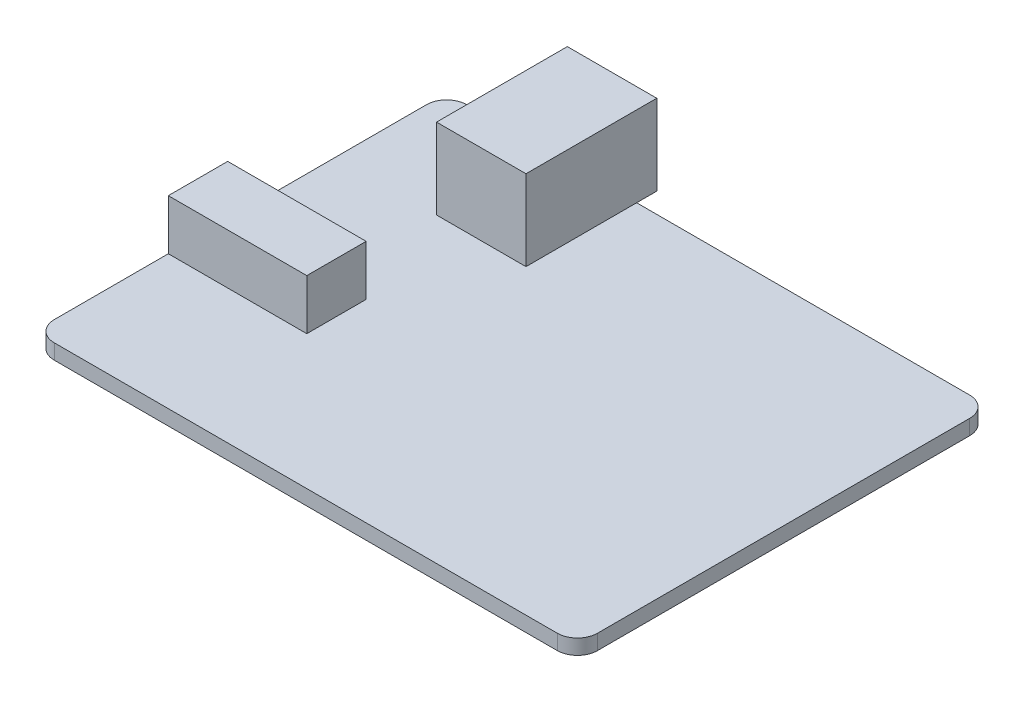
ISO-10303-21;
HEADER;
FILE_DESCRIPTION(('STEP AP214'),'2;1');
FILE_NAME('part.step','',(''),(''),'','','');
FILE_SCHEMA(('AUTOMOTIVE_DESIGN { 1 0 10303 214 1 1 1 1 }'));
ENDSEC;
DATA;
#1=APPLICATION_CONTEXT('core data for automotive mechanical design processes');
#2=APPLICATION_PROTOCOL_DEFINITION('international standard','automotive_design',2000,#1);
#3=PRODUCT_CONTEXT('',#1,'mechanical');
#4=PRODUCT('Part','Part','',(#3));
#5=PRODUCT_RELATED_PRODUCT_CATEGORY('part','',(#4));
#6=PRODUCT_DEFINITION_FORMATION('','',#4);
#7=PRODUCT_DEFINITION_CONTEXT('part definition',#1,'design');
#8=PRODUCT_DEFINITION('design','',#6,#7);
#9=PRODUCT_DEFINITION_SHAPE('','',#8);
#10=(LENGTH_UNIT() NAMED_UNIT(*) SI_UNIT(.MILLI.,.METRE.));
#11=(NAMED_UNIT(*) PLANE_ANGLE_UNIT() SI_UNIT($,.RADIAN.));
#12=(NAMED_UNIT(*) SI_UNIT($,.STERADIAN.) SOLID_ANGLE_UNIT());
#13=UNCERTAINTY_MEASURE_WITH_UNIT(LENGTH_MEASURE(1.E-05),#10,'distance_accuracy_value','');
#14=(GEOMETRIC_REPRESENTATION_CONTEXT(3) GLOBAL_UNCERTAINTY_ASSIGNED_CONTEXT((#13)) GLOBAL_UNIT_ASSIGNED_CONTEXT((#10,
#11,#12)) REPRESENTATION_CONTEXT('',''));
#15=CARTESIAN_POINT('',(0.,0.,0.));
#16=DIRECTION('',(0.,0.,1.));
#17=DIRECTION('',(1.,0.,0.));
#18=AXIS2_PLACEMENT_3D('',#15,#16,#17);
#19=CARTESIAN_POINT('',(0.,1.5,0.));
#20=DIRECTION('',(0.,-1.,0.));
#21=DIRECTION('',(0.,0.,-1.));
#22=AXIS2_PLACEMENT_3D('',#19,#20,#21);
#23=PLANE('',#22);
#24=DIRECTION('',(-1.,0.,0.));
#25=VECTOR('',#24,1.);
#26=CARTESIAN_POINT('',(13.7650080663848,1.5,-19.2368736736892));
#27=LINE('',#26,#25);
#28=CARTESIAN_POINT('',(13.7650080663848,1.5,-19.2368736736892));
#29=VERTEX_POINT('',#28);
#30=CARTESIAN_POINT('',(0.,1.5,-19.2368736736892));
#31=VERTEX_POINT('',#30);
#32=EDGE_CURVE('E50',#29,#31,#27,.T.);
#33=ORIENTED_EDGE('',*,*,#32,.F.);
#34=DIRECTION('',(0.,0.,-1.));
#35=VECTOR('',#34,1.);
#36=CARTESIAN_POINT('',(13.7650080663848,1.5,-19.2368736736892));
#37=LINE('',#36,#35);
#38=CARTESIAN_POINT('',(13.7650080663848,1.5,-13.3355569240685));
#39=VERTEX_POINT('',#38);
#40=EDGE_CURVE('E55',#39,#29,#37,.T.);
#41=ORIENTED_EDGE('',*,*,#40,.F.);
#42=DIRECTION('',(1.,0.,0.));
#43=VECTOR('',#42,1.);
#44=CARTESIAN_POINT('',(13.7650080663848,1.5,-13.3355569240685));
#45=LINE('',#44,#43);
#46=CARTESIAN_POINT('',(0.,1.5,-13.3355569240685));
#47=VERTEX_POINT('',#46);
#48=EDGE_CURVE('E172',#47,#39,#45,.T.);
#49=ORIENTED_EDGE('',*,*,#48,.F.);
#50=DIRECTION('',(0.,0.,1.));
#51=VECTOR('',#50,1.);
#52=CARTESIAN_POINT('',(0.,1.5,0.));
#53=LINE('',#52,#51);
#54=CARTESIAN_POINT('',(0.,1.5,-2.));
#55=VERTEX_POINT('',#54);
#56=EDGE_CURVE('E218',#47,#55,#53,.T.);
#57=ORIENTED_EDGE('',*,*,#56,.T.);
#58=CARTESIAN_POINT('',(2.,1.5,-2.));
#59=DIRECTION('',(0.,-1.,0.));
#60=DIRECTION('',(0.,0.,-1.));
#61=AXIS2_PLACEMENT_3D('',#58,#59,#60);
#62=CIRCLE('',#61,2.);
#63=CARTESIAN_POINT('',(2.,1.5,0.));
#64=VERTEX_POINT('',#63);
#65=EDGE_CURVE('E264',#55,#64,#62,.F.);
#66=ORIENTED_EDGE('',*,*,#65,.T.);
#67=DIRECTION('',(1.,0.,0.));
#68=VECTOR('',#67,1.);
#69=CARTESIAN_POINT('',(0.,1.5,0.));
#70=LINE('',#69,#68);
#71=CARTESIAN_POINT('',(52.,1.5,0.));
#72=VERTEX_POINT('',#71);
#73=EDGE_CURVE('E217',#64,#72,#70,.T.);
#74=ORIENTED_EDGE('',*,*,#73,.T.);
#75=CARTESIAN_POINT('',(52.,1.5,-2.));
#76=DIRECTION('',(0.,-1.,0.));
#77=DIRECTION('',(0.,0.,-1.));
#78=AXIS2_PLACEMENT_3D('',#75,#76,#77);
#79=CIRCLE('',#78,2.);
#80=CARTESIAN_POINT('',(54.,1.5,-2.));
#81=VERTEX_POINT('',#80);
#82=EDGE_CURVE('E262',#72,#81,#79,.F.);
#83=ORIENTED_EDGE('',*,*,#82,.T.);
#84=DIRECTION('',(0.,0.,-1.));
#85=VECTOR('',#84,1.);
#86=CARTESIAN_POINT('',(54.,1.5,0.));
#87=LINE('',#86,#85);
#88=CARTESIAN_POINT('',(54.,1.5,-39.));
#89=VERTEX_POINT('',#88);
#90=EDGE_CURVE('E221',#81,#89,#87,.T.);
#91=ORIENTED_EDGE('',*,*,#90,.T.);
#92=CARTESIAN_POINT('',(52.,1.5,-39.));
#93=DIRECTION('',(0.,-1.,0.));
#94=DIRECTION('',(0.,0.,-1.));
#95=AXIS2_PLACEMENT_3D('',#92,#93,#94);
#96=CIRCLE('',#95,2.);
#97=CARTESIAN_POINT('',(52.,1.5,-41.));
#98=VERTEX_POINT('',#97);
#99=EDGE_CURVE('E260',#89,#98,#96,.F.);
#100=ORIENTED_EDGE('',*,*,#99,.T.);
#101=DIRECTION('',(-1.,0.,0.));
#102=VECTOR('',#101,1.);
#103=CARTESIAN_POINT('',(0.,1.5,-41.));
#104=LINE('',#103,#102);
#105=CARTESIAN_POINT('',(18.89,1.5,-41.));
#106=VERTEX_POINT('',#105);
#107=EDGE_CURVE('E225',#98,#106,#104,.T.);
#108=ORIENTED_EDGE('',*,*,#107,.T.);
#109=DIRECTION('',(0.,0.,-1.));
#110=VECTOR('',#109,1.);
#111=CARTESIAN_POINT('',(18.89,1.5,-30.));
#112=LINE('',#111,#110);
#113=CARTESIAN_POINT('',(18.89,1.5,-30.));
#114=VERTEX_POINT('',#113);
#115=EDGE_CURVE('E199',#114,#106,#112,.T.);
#116=ORIENTED_EDGE('',*,*,#115,.F.);
#117=DIRECTION('',(1.,0.,0.));
#118=VECTOR('',#117,1.);
#119=CARTESIAN_POINT('',(9.99999999999999,1.5,-30.));
#120=LINE('',#119,#118);
#121=CARTESIAN_POINT('',(9.99999999999999,1.5,-30.));
#122=VERTEX_POINT('',#121);
#123=EDGE_CURVE('E178',#122,#114,#120,.T.);
#124=ORIENTED_EDGE('',*,*,#123,.F.);
#125=DIRECTION('',(0.,0.,1.));
#126=VECTOR('',#125,1.);
#127=CARTESIAN_POINT('',(9.99999999999999,1.5,-30.));
#128=LINE('',#127,#126);
#129=CARTESIAN_POINT('',(9.99999999999999,1.5,-41.));
#130=VERTEX_POINT('',#129);
#131=EDGE_CURVE('E180',#130,#122,#128,.T.);
#132=ORIENTED_EDGE('',*,*,#131,.F.);
#133=CARTESIAN_POINT('',(1.99999999999999,1.5,-41.));
#134=VERTEX_POINT('',#133);
#135=EDGE_CURVE('E224',#130,#134,#104,.T.);
#136=ORIENTED_EDGE('',*,*,#135,.T.);
#137=CARTESIAN_POINT('',(1.99999999999999,1.5,-39.));
#138=DIRECTION('',(0.,-1.,0.));
#139=DIRECTION('',(0.,0.,-1.));
#140=AXIS2_PLACEMENT_3D('',#137,#138,#139);
#141=CIRCLE('',#140,2.);
#142=CARTESIAN_POINT('',(0.,1.5,-39.));
#143=VERTEX_POINT('',#142);
#144=EDGE_CURVE('E258',#134,#143,#141,.F.);
#145=ORIENTED_EDGE('',*,*,#144,.T.);
#146=EDGE_CURVE('E215',#143,#31,#53,.T.);
#147=ORIENTED_EDGE('',*,*,#146,.T.);
#148=EDGE_LOOP('',(#33,#41,#49,#57,#66,#74,#83,#91,#100,#108,#116,#124,#132,#136,#145,#147));
#149=FACE_BOUND('',#148,.T.);
#150=ADVANCED_FACE('F35',(#149),#23,.F.);
#151=CARTESIAN_POINT('',(0.,1.5,0.));
#152=DIRECTION('',(1.,0.,0.));
#153=DIRECTION('',(0.,0.,-1.));
#154=AXIS2_PLACEMENT_3D('',#151,#152,#153);
#155=PLANE('',#154);
#156=CARTESIAN_POINT('',(0.,4.,-16.2862152988788));
#157=DIRECTION('',(-1.,0.,0.));
#158=DIRECTION('',(0.,0.,1.));
#159=AXIS2_PLACEMENT_3D('',#156,#157,#158);
#160=CIRCLE('',#159,1.5875);
#161=CARTESIAN_POINT('',(0.,4.,-14.6987152988788));
#162=VERTEX_POINT('',#161);
#163=EDGE_CURVE('E469',#162,#162,#160,.T.);
#164=ORIENTED_EDGE('',*,*,#163,.F.);
#165=EDGE_LOOP('',(#164));
#166=FACE_BOUND('',#165,.T.);
#167=DIRECTION('',(0.,0.,1.));
#168=VECTOR('',#167,1.);
#169=CARTESIAN_POINT('',(0.,0.,0.));
#170=LINE('',#169,#168);
#171=CARTESIAN_POINT('',(0.,0.,-39.));
#172=VERTEX_POINT('',#171);
#173=CARTESIAN_POINT('',(0.,0.,-2.));
#174=VERTEX_POINT('',#173);
#175=EDGE_CURVE('E214',#172,#174,#170,.T.);
#176=ORIENTED_EDGE('',*,*,#175,.T.);
#177=DIRECTION('',(0.,-1.,0.));
#178=VECTOR('',#177,1.);
#179=CARTESIAN_POINT('',(0.,1.5,-2.));
#180=LINE('',#179,#178);
#181=EDGE_CURVE('E255',#174,#55,#180,.F.);
#182=ORIENTED_EDGE('',*,*,#181,.T.);
#183=ORIENTED_EDGE('',*,*,#56,.F.);
#184=DIRECTION('',(0.,-1.,0.));
#185=VECTOR('',#184,1.);
#186=CARTESIAN_POINT('',(0.,6.5,-13.3355569240685));
#187=LINE('',#186,#185);
#188=CARTESIAN_POINT('',(0.,6.5,-13.3355569240685));
#189=VERTEX_POINT('',#188);
#190=EDGE_CURVE('E181',#189,#47,#187,.T.);
#191=ORIENTED_EDGE('',*,*,#190,.F.);
#192=DIRECTION('',(0.,0.,1.));
#193=VECTOR('',#192,1.);
#194=CARTESIAN_POINT('',(0.,6.5,-19.2368736736892));
#195=LINE('',#194,#193);
#196=CARTESIAN_POINT('',(0.,6.5,-19.2368736736892));
#197=VERTEX_POINT('',#196);
#198=EDGE_CURVE('E162',#197,#189,#195,.T.);
#199=ORIENTED_EDGE('',*,*,#198,.F.);
#200=DIRECTION('',(0.,-1.,0.));
#201=VECTOR('',#200,1.);
#202=CARTESIAN_POINT('',(0.,6.5,-19.2368736736892));
#203=LINE('',#202,#201);
#204=EDGE_CURVE('E159',#197,#31,#203,.T.);
#205=ORIENTED_EDGE('',*,*,#204,.T.);
#206=ORIENTED_EDGE('',*,*,#146,.F.);
#207=DIRECTION('',(0.,-1.,0.));
#208=VECTOR('',#207,1.);
#209=CARTESIAN_POINT('',(0.,1.5,-39.));
#210=LINE('',#209,#208);
#211=EDGE_CURVE('E252',#143,#172,#210,.T.);
#212=ORIENTED_EDGE('',*,*,#211,.T.);
#213=EDGE_LOOP('',(#176,#182,#183,#191,#199,#205,#206,#212));
#214=FACE_BOUND('',#213,.T.);
#215=ADVANCED_FACE('F286',(#166,#214),#155,.F.);
#216=CARTESIAN_POINT('',(0.,1.5,0.));
#217=DIRECTION('',(0.,0.,-1.));
#218=DIRECTION('',(-1.,0.,0.));
#219=AXIS2_PLACEMENT_3D('',#216,#217,#218);
#220=PLANE('',#219);
#221=ORIENTED_EDGE('',*,*,#73,.F.);
#222=DIRECTION('',(0.,-1.,0.));
#223=VECTOR('',#222,1.);
#224=CARTESIAN_POINT('',(2.,1.5,0.));
#225=LINE('',#224,#223);
#226=CARTESIAN_POINT('',(2.,0.,0.));
#227=VERTEX_POINT('',#226);
#228=EDGE_CURVE('E241',#64,#227,#225,.T.);
#229=ORIENTED_EDGE('',*,*,#228,.T.);
#230=DIRECTION('',(1.,0.,0.));
#231=VECTOR('',#230,1.);
#232=CARTESIAN_POINT('',(0.,0.,0.));
#233=LINE('',#232,#231);
#234=CARTESIAN_POINT('',(52.,0.,0.));
#235=VERTEX_POINT('',#234);
#236=EDGE_CURVE('E230',#227,#235,#233,.T.);
#237=ORIENTED_EDGE('',*,*,#236,.T.);
#238=DIRECTION('',(0.,-1.,0.));
#239=VECTOR('',#238,1.);
#240=CARTESIAN_POINT('',(52.,1.5,0.));
#241=LINE('',#240,#239);
#242=EDGE_CURVE('E239',#235,#72,#241,.F.);
#243=ORIENTED_EDGE('',*,*,#242,.T.);
#244=EDGE_LOOP('',(#221,#229,#237,#243));
#245=FACE_BOUND('',#244,.T.);
#246=ADVANCED_FACE('F297',(#245),#220,.F.);
#247=CARTESIAN_POINT('',(54.,1.5,0.));
#248=DIRECTION('',(-1.,0.,0.));
#249=DIRECTION('',(0.,0.,1.));
#250=AXIS2_PLACEMENT_3D('',#247,#248,#249);
#251=PLANE('',#250);
#252=ORIENTED_EDGE('',*,*,#90,.F.);
#253=DIRECTION('',(0.,-1.,0.));
#254=VECTOR('',#253,1.);
#255=CARTESIAN_POINT('',(54.,1.5,-2.));
#256=LINE('',#255,#254);
#257=CARTESIAN_POINT('',(54.,0.,-2.));
#258=VERTEX_POINT('',#257);
#259=EDGE_CURVE('E268',#81,#258,#256,.T.);
#260=ORIENTED_EDGE('',*,*,#259,.T.);
#261=DIRECTION('',(0.,0.,-1.));
#262=VECTOR('',#261,1.);
#263=CARTESIAN_POINT('',(54.,0.,0.));
#264=LINE('',#263,#262);
#265=CARTESIAN_POINT('',(54.,0.,-39.));
#266=VERTEX_POINT('',#265);
#267=EDGE_CURVE('E233',#258,#266,#264,.T.);
#268=ORIENTED_EDGE('',*,*,#267,.T.);
#269=DIRECTION('',(0.,-1.,0.));
#270=VECTOR('',#269,1.);
#271=CARTESIAN_POINT('',(54.,1.5,-39.));
#272=LINE('',#271,#270);
#273=EDGE_CURVE('E266',#266,#89,#272,.F.);
#274=ORIENTED_EDGE('',*,*,#273,.T.);
#275=EDGE_LOOP('',(#252,#260,#268,#274));
#276=FACE_BOUND('',#275,.T.);
#277=ADVANCED_FACE('F306',(#276),#251,.F.);
#278=CARTESIAN_POINT('',(0.,1.5,-41.));
#279=DIRECTION('',(0.,0.,1.));
#280=DIRECTION('',(1.,0.,0.));
#281=AXIS2_PLACEMENT_3D('',#278,#279,#280);
#282=PLANE('',#281);
#283=ORIENTED_EDGE('',*,*,#107,.F.);
#284=DIRECTION('',(0.,-1.,0.));
#285=VECTOR('',#284,1.);
#286=CARTESIAN_POINT('',(52.,1.5,-41.));
#287=LINE('',#286,#285);
#288=CARTESIAN_POINT('',(52.,0.,-41.));
#289=VERTEX_POINT('',#288);
#290=EDGE_CURVE('E11',#98,#289,#287,.T.);
#291=ORIENTED_EDGE('',*,*,#290,.T.);
#292=DIRECTION('',(-1.,0.,0.));
#293=VECTOR('',#292,1.);
#294=CARTESIAN_POINT('',(0.,0.,-41.));
#295=LINE('',#294,#293);
#296=CARTESIAN_POINT('',(1.99999999999999,0.,-41.));
#297=VERTEX_POINT('',#296);
#298=EDGE_CURVE('E236',#289,#297,#295,.T.);
#299=ORIENTED_EDGE('',*,*,#298,.T.);
#300=DIRECTION('',(0.,-1.,0.));
#301=VECTOR('',#300,1.);
#302=CARTESIAN_POINT('',(1.99999999999999,1.5,-41.));
#303=LINE('',#302,#301);
#304=EDGE_CURVE('E43',#297,#134,#303,.F.);
#305=ORIENTED_EDGE('',*,*,#304,.T.);
#306=ORIENTED_EDGE('',*,*,#135,.F.);
#307=EDGE_CURVE('E227',#106,#130,#104,.T.);
#308=ORIENTED_EDGE('',*,*,#307,.F.);
#309=EDGE_LOOP('',(#283,#291,#299,#305,#306,#308));
#310=FACE_BOUND('',#309,.T.);
#311=ADVANCED_FACE('F275',(#310),#282,.F.);
#312=CARTESIAN_POINT('',(0.,0.,0.));
#313=DIRECTION('',(0.,-1.,0.));
#314=DIRECTION('',(0.,0.,-1.));
#315=AXIS2_PLACEMENT_3D('',#312,#313,#314);
#316=PLANE('',#315);
#317=ORIENTED_EDGE('',*,*,#236,.F.);
#318=CARTESIAN_POINT('',(2.,0.,-2.));
#319=DIRECTION('',(0.,-1.,0.));
#320=DIRECTION('',(0.,0.,-1.));
#321=AXIS2_PLACEMENT_3D('',#318,#319,#320);
#322=CIRCLE('',#321,2.);
#323=EDGE_CURVE('E250',#227,#174,#322,.T.);
#324=ORIENTED_EDGE('',*,*,#323,.T.);
#325=ORIENTED_EDGE('',*,*,#175,.F.);
#326=CARTESIAN_POINT('',(1.99999999999999,0.,-39.));
#327=DIRECTION('',(0.,-1.,0.));
#328=DIRECTION('',(0.,0.,-1.));
#329=AXIS2_PLACEMENT_3D('',#326,#327,#328);
#330=CIRCLE('',#329,2.);
#331=EDGE_CURVE('E244',#172,#297,#330,.T.);
#332=ORIENTED_EDGE('',*,*,#331,.T.);
#333=ORIENTED_EDGE('',*,*,#298,.F.);
#334=CARTESIAN_POINT('',(52.,0.,-39.));
#335=DIRECTION('',(0.,-1.,0.));
#336=DIRECTION('',(0.,0.,-1.));
#337=AXIS2_PLACEMENT_3D('',#334,#335,#336);
#338=CIRCLE('',#337,2.);
#339=EDGE_CURVE('E246',#289,#266,#338,.T.);
#340=ORIENTED_EDGE('',*,*,#339,.T.);
#341=ORIENTED_EDGE('',*,*,#267,.F.);
#342=CARTESIAN_POINT('',(52.,0.,-2.));
#343=DIRECTION('',(0.,-1.,0.));
#344=DIRECTION('',(0.,0.,-1.));
#345=AXIS2_PLACEMENT_3D('',#342,#343,#344);
#346=CIRCLE('',#345,2.);
#347=EDGE_CURVE('E248',#258,#235,#346,.T.);
#348=ORIENTED_EDGE('',*,*,#347,.T.);
#349=EDGE_LOOP('',(#317,#324,#325,#332,#333,#340,#341,#348));
#350=FACE_BOUND('',#349,.T.);
#351=ADVANCED_FACE('F290',(#350),#316,.T.);
#352=CARTESIAN_POINT('',(9.99999999999999,9.5,-30.));
#353=DIRECTION('',(1.,0.,0.));
#354=DIRECTION('',(0.,0.,-1.));
#355=AXIS2_PLACEMENT_3D('',#352,#353,#354);
#356=PLANE('',#355);
#357=CARTESIAN_POINT('',(9.99999999999999,1.5,-43.));
#358=VERTEX_POINT('',#357);
#359=EDGE_CURVE('E175',#358,#130,#128,.T.);
#360=ORIENTED_EDGE('',*,*,#359,.T.);
#361=ORIENTED_EDGE('',*,*,#131,.T.);
#362=DIRECTION('',(0.,-1.,0.));
#363=VECTOR('',#362,1.);
#364=CARTESIAN_POINT('',(9.99999999999999,9.5,-30.));
#365=LINE('',#364,#363);
#366=CARTESIAN_POINT('',(9.99999999999999,9.5,-30.));
#367=VERTEX_POINT('',#366);
#368=EDGE_CURVE('E211',#367,#122,#365,.T.);
#369=ORIENTED_EDGE('',*,*,#368,.F.);
#370=DIRECTION('',(0.,0.,1.));
#371=VECTOR('',#370,1.);
#372=CARTESIAN_POINT('',(9.99999999999999,9.5,-30.));
#373=LINE('',#372,#371);
#374=CARTESIAN_POINT('',(9.99999999999999,9.5,-43.));
#375=VERTEX_POINT('',#374);
#376=EDGE_CURVE('E185',#375,#367,#373,.T.);
#377=ORIENTED_EDGE('',*,*,#376,.F.);
#378=DIRECTION('',(0.,-1.,0.));
#379=VECTOR('',#378,1.);
#380=CARTESIAN_POINT('',(9.99999999999999,9.5,-43.));
#381=LINE('',#380,#379);
#382=EDGE_CURVE('E194',#375,#358,#381,.T.);
#383=ORIENTED_EDGE('',*,*,#382,.T.);
#384=EDGE_LOOP('',(#360,#361,#369,#377,#383));
#385=FACE_BOUND('',#384,.T.);
#386=ADVANCED_FACE('F327',(#385),#356,.F.);
#387=CARTESIAN_POINT('',(9.99999999999999,9.5,-30.));
#388=DIRECTION('',(0.,0.,-1.));
#389=DIRECTION('',(-1.,0.,0.));
#390=AXIS2_PLACEMENT_3D('',#387,#388,#389);
#391=PLANE('',#390);
#392=ORIENTED_EDGE('',*,*,#123,.T.);
#393=DIRECTION('',(0.,-1.,0.));
#394=VECTOR('',#393,1.);
#395=CARTESIAN_POINT('',(18.89,9.5,-30.));
#396=LINE('',#395,#394);
#397=CARTESIAN_POINT('',(18.89,9.5,-30.));
#398=VERTEX_POINT('',#397);
#399=EDGE_CURVE('E208',#398,#114,#396,.T.);
#400=ORIENTED_EDGE('',*,*,#399,.F.);
#401=DIRECTION('',(1.,0.,0.));
#402=VECTOR('',#401,1.);
#403=CARTESIAN_POINT('',(9.99999999999999,9.5,-30.));
#404=LINE('',#403,#402);
#405=EDGE_CURVE('E188',#367,#398,#404,.T.);
#406=ORIENTED_EDGE('',*,*,#405,.F.);
#407=ORIENTED_EDGE('',*,*,#368,.T.);
#408=EDGE_LOOP('',(#392,#400,#406,#407));
#409=FACE_BOUND('',#408,.T.);
#410=ADVANCED_FACE('F316',(#409),#391,.F.);
#411=CARTESIAN_POINT('',(18.89,9.5,-30.));
#412=DIRECTION('',(-1.,0.,0.));
#413=DIRECTION('',(0.,0.,1.));
#414=AXIS2_PLACEMENT_3D('',#411,#412,#413);
#415=PLANE('',#414);
#416=ORIENTED_EDGE('',*,*,#115,.T.);
#417=CARTESIAN_POINT('',(18.89,1.5,-43.));
#418=VERTEX_POINT('',#417);
#419=EDGE_CURVE('E198',#106,#418,#112,.T.);
#420=ORIENTED_EDGE('',*,*,#419,.T.);
#421=DIRECTION('',(0.,-1.,0.));
#422=VECTOR('',#421,1.);
#423=CARTESIAN_POINT('',(18.89,9.5,-43.));
#424=LINE('',#423,#422);
#425=CARTESIAN_POINT('',(18.89,9.5,-43.));
#426=VERTEX_POINT('',#425);
#427=EDGE_CURVE('E205',#426,#418,#424,.T.);
#428=ORIENTED_EDGE('',*,*,#427,.F.);
#429=DIRECTION('',(0.,0.,-1.));
#430=VECTOR('',#429,1.);
#431=CARTESIAN_POINT('',(18.89,9.5,-30.));
#432=LINE('',#431,#430);
#433=EDGE_CURVE('E191',#398,#426,#432,.T.);
#434=ORIENTED_EDGE('',*,*,#433,.F.);
#435=ORIENTED_EDGE('',*,*,#399,.T.);
#436=EDGE_LOOP('',(#416,#420,#428,#434,#435));
#437=FACE_BOUND('',#436,.T.);
#438=ADVANCED_FACE('F319',(#437),#415,.F.);
#439=CARTESIAN_POINT('',(9.99999999999999,9.5,-43.));
#440=DIRECTION('',(0.,0.,1.));
#441=DIRECTION('',(1.,0.,0.));
#442=AXIS2_PLACEMENT_3D('',#439,#440,#441);
#443=PLANE('',#442);
#444=DIRECTION('',(-1.,0.,0.));
#445=VECTOR('',#444,1.);
#446=CARTESIAN_POINT('',(9.99999999999999,1.5,-43.));
#447=LINE('',#446,#445);
#448=EDGE_CURVE('E189',#418,#358,#447,.T.);
#449=ORIENTED_EDGE('',*,*,#448,.T.);
#450=ORIENTED_EDGE('',*,*,#382,.F.);
#451=DIRECTION('',(-1.,0.,0.));
#452=VECTOR('',#451,1.);
#453=CARTESIAN_POINT('',(9.99999999999999,9.5,-43.));
#454=LINE('',#453,#452);
#455=EDGE_CURVE('E193',#426,#375,#454,.T.);
#456=ORIENTED_EDGE('',*,*,#455,.F.);
#457=ORIENTED_EDGE('',*,*,#427,.T.);
#458=EDGE_LOOP('',(#449,#450,#456,#457));
#459=FACE_BOUND('',#458,.T.);
#460=ADVANCED_FACE('F333',(#459),#443,.F.);
#461=CARTESIAN_POINT('',(0.,9.5,0.));
#462=DIRECTION('',(0.,-1.,0.));
#463=DIRECTION('',(0.,0.,-1.));
#464=AXIS2_PLACEMENT_3D('',#461,#462,#463);
#465=PLANE('',#464);
#466=ORIENTED_EDGE('',*,*,#376,.T.);
#467=ORIENTED_EDGE('',*,*,#405,.T.);
#468=ORIENTED_EDGE('',*,*,#433,.T.);
#469=ORIENTED_EDGE('',*,*,#455,.T.);
#470=EDGE_LOOP('',(#466,#467,#468,#469));
#471=FACE_BOUND('',#470,.T.);
#472=ADVANCED_FACE('F323',(#471),#465,.F.);
#473=CARTESIAN_POINT('',(0.,1.5,0.));
#474=DIRECTION('',(0.,-1.,0.));
#475=DIRECTION('',(0.,0.,-1.));
#476=AXIS2_PLACEMENT_3D('',#473,#474,#475);
#477=PLANE('',#476);
#478=ORIENTED_EDGE('',*,*,#419,.F.);
#479=ORIENTED_EDGE('',*,*,#307,.T.);
#480=ORIENTED_EDGE('',*,*,#359,.F.);
#481=ORIENTED_EDGE('',*,*,#448,.F.);
#482=EDGE_LOOP('',(#478,#479,#480,#481));
#483=FACE_BOUND('',#482,.T.);
#484=ADVANCED_FACE('F331',(#483),#477,.T.);
#485=CARTESIAN_POINT('',(2.,1.5,-2.));
#486=DIRECTION('',(0.,-1.,0.));
#487=DIRECTION('',(0.,0.,-1.));
#488=AXIS2_PLACEMENT_3D('',#485,#486,#487);
#489=CYLINDRICAL_SURFACE('',#488,2.);
#490=ORIENTED_EDGE('',*,*,#65,.F.);
#491=ORIENTED_EDGE('',*,*,#181,.F.);
#492=ORIENTED_EDGE('',*,*,#323,.F.);
#493=ORIENTED_EDGE('',*,*,#228,.F.);
#494=EDGE_LOOP('',(#490,#491,#492,#493));
#495=FACE_BOUND('',#494,.T.);
#496=ADVANCED_FACE('F294',(#495),#489,.T.);
#497=CARTESIAN_POINT('',(52.,1.5,-2.));
#498=DIRECTION('',(0.,-1.,0.));
#499=DIRECTION('',(0.,0.,-1.));
#500=AXIS2_PLACEMENT_3D('',#497,#498,#499);
#501=CYLINDRICAL_SURFACE('',#500,2.);
#502=ORIENTED_EDGE('',*,*,#82,.F.);
#503=ORIENTED_EDGE('',*,*,#242,.F.);
#504=ORIENTED_EDGE('',*,*,#347,.F.);
#505=ORIENTED_EDGE('',*,*,#259,.F.);
#506=EDGE_LOOP('',(#502,#503,#504,#505));
#507=FACE_BOUND('',#506,.T.);
#508=ADVANCED_FACE('F303',(#507),#501,.T.);
#509=CARTESIAN_POINT('',(52.,1.5,-39.));
#510=DIRECTION('',(0.,-1.,0.));
#511=DIRECTION('',(0.,0.,-1.));
#512=AXIS2_PLACEMENT_3D('',#509,#510,#511);
#513=CYLINDRICAL_SURFACE('',#512,2.);
#514=ORIENTED_EDGE('',*,*,#99,.F.);
#515=ORIENTED_EDGE('',*,*,#273,.F.);
#516=ORIENTED_EDGE('',*,*,#339,.F.);
#517=ORIENTED_EDGE('',*,*,#290,.F.);
#518=EDGE_LOOP('',(#514,#515,#516,#517));
#519=FACE_BOUND('',#518,.T.);
#520=ADVANCED_FACE('F311',(#519),#513,.T.);
#521=CARTESIAN_POINT('',(1.99999999999999,1.5,-39.));
#522=DIRECTION('',(0.,-1.,0.));
#523=DIRECTION('',(0.,0.,-1.));
#524=AXIS2_PLACEMENT_3D('',#521,#522,#523);
#525=CYLINDRICAL_SURFACE('',#524,2.);
#526=ORIENTED_EDGE('',*,*,#144,.F.);
#527=ORIENTED_EDGE('',*,*,#304,.F.);
#528=ORIENTED_EDGE('',*,*,#331,.F.);
#529=ORIENTED_EDGE('',*,*,#211,.F.);
#530=EDGE_LOOP('',(#526,#527,#528,#529));
#531=FACE_BOUND('',#530,.T.);
#532=ADVANCED_FACE('F37',(#531),#525,.T.);
#533=CARTESIAN_POINT('',(13.7650080663848,6.5,-19.2368736736892));
#534=DIRECTION('',(-1.,0.,0.));
#535=DIRECTION('',(0.,0.,1.));
#536=AXIS2_PLACEMENT_3D('',#533,#534,#535);
#537=PLANE('',#536);
#538=ORIENTED_EDGE('',*,*,#40,.T.);
#539=DIRECTION('',(0.,-1.,0.));
#540=VECTOR('',#539,1.);
#541=CARTESIAN_POINT('',(13.7650080663848,6.5,-19.2368736736892));
#542=LINE('',#541,#540);
#543=CARTESIAN_POINT('',(13.7650080663848,6.5,-19.2368736736892));
#544=VERTEX_POINT('',#543);
#545=EDGE_CURVE('E157',#544,#29,#542,.T.);
#546=ORIENTED_EDGE('',*,*,#545,.F.);
#547=DIRECTION('',(0.,0.,-1.));
#548=VECTOR('',#547,1.);
#549=CARTESIAN_POINT('',(13.7650080663848,6.5,-19.2368736736892));
#550=LINE('',#549,#548);
#551=CARTESIAN_POINT('',(13.7650080663848,6.5,-13.3355569240685));
#552=VERTEX_POINT('',#551);
#553=EDGE_CURVE('E163',#552,#544,#550,.T.);
#554=ORIENTED_EDGE('',*,*,#553,.F.);
#555=DIRECTION('',(0.,-1.,0.));
#556=VECTOR('',#555,1.);
#557=CARTESIAN_POINT('',(13.7650080663848,6.5,-13.3355569240685));
#558=LINE('',#557,#556);
#559=EDGE_CURVE('E476',#552,#39,#558,.T.);
#560=ORIENTED_EDGE('',*,*,#559,.T.);
#561=EDGE_LOOP('',(#538,#546,#554,#560));
#562=FACE_BOUND('',#561,.T.);
#563=ADVANCED_FACE('F174',(#562),#537,.F.);
#564=CARTESIAN_POINT('',(13.7650080663848,6.5,-19.2368736736892));
#565=DIRECTION('',(0.,0.,1.));
#566=DIRECTION('',(1.,0.,0.));
#567=AXIS2_PLACEMENT_3D('',#564,#565,#566);
#568=PLANE('',#567);
#569=ORIENTED_EDGE('',*,*,#32,.T.);
#570=ORIENTED_EDGE('',*,*,#204,.F.);
#571=DIRECTION('',(-1.,0.,0.));
#572=VECTOR('',#571,1.);
#573=CARTESIAN_POINT('',(13.7650080663848,6.5,-19.2368736736892));
#574=LINE('',#573,#572);
#575=EDGE_CURVE('E153',#544,#197,#574,.T.);
#576=ORIENTED_EDGE('',*,*,#575,.F.);
#577=ORIENTED_EDGE('',*,*,#545,.T.);
#578=EDGE_LOOP('',(#569,#570,#576,#577));
#579=FACE_BOUND('',#578,.T.);
#580=ADVANCED_FACE('F155',(#579),#568,.F.);
#581=CARTESIAN_POINT('',(13.7650080663848,6.5,-13.3355569240685));
#582=DIRECTION('',(0.,0.,-1.));
#583=DIRECTION('',(-1.,0.,0.));
#584=AXIS2_PLACEMENT_3D('',#581,#582,#583);
#585=PLANE('',#584);
#586=ORIENTED_EDGE('',*,*,#48,.T.);
#587=ORIENTED_EDGE('',*,*,#559,.F.);
#588=DIRECTION('',(1.,0.,0.));
#589=VECTOR('',#588,1.);
#590=CARTESIAN_POINT('',(13.7650080663848,6.5,-13.3355569240685));
#591=LINE('',#590,#589);
#592=EDGE_CURVE('E168',#189,#552,#591,.T.);
#593=ORIENTED_EDGE('',*,*,#592,.F.);
#594=ORIENTED_EDGE('',*,*,#190,.T.);
#595=EDGE_LOOP('',(#586,#587,#593,#594));
#596=FACE_BOUND('',#595,.T.);
#597=ADVANCED_FACE('F376',(#596),#585,.F.);
#598=CARTESIAN_POINT('',(0.,6.5,0.));
#599=DIRECTION('',(0.,-1.,0.));
#600=DIRECTION('',(0.,0.,-1.));
#601=AXIS2_PLACEMENT_3D('',#598,#599,#600);
#602=PLANE('',#601);
#603=ORIENTED_EDGE('',*,*,#553,.T.);
#604=ORIENTED_EDGE('',*,*,#575,.T.);
#605=ORIENTED_EDGE('',*,*,#198,.T.);
#606=ORIENTED_EDGE('',*,*,#592,.T.);
#607=EDGE_LOOP('',(#603,#604,#605,#606));
#608=FACE_BOUND('',#607,.T.);
#609=ADVANCED_FACE('F166',(#608),#602,.F.);
#610=CARTESIAN_POINT('',(10.,4.,-16.2862152988788));
#611=DIRECTION('',(-1.,0.,0.));
#612=DIRECTION('',(0.,0.,1.));
#613=AXIS2_PLACEMENT_3D('',#610,#611,#612);
#614=CYLINDRICAL_SURFACE('',#613,1.5875);
#615=CARTESIAN_POINT('',(10.,4.,-16.2862152988788));
#616=DIRECTION('',(-1.,0.,0.));
#617=DIRECTION('',(0.,0.,1.));
#618=AXIS2_PLACEMENT_3D('',#615,#616,#617);
#619=CIRCLE('',#618,1.5875);
#620=CARTESIAN_POINT('',(10.,4.,-14.6987152988788));
#621=VERTEX_POINT('',#620);
#622=EDGE_CURVE('E468',#621,#621,#619,.T.);
#623=ORIENTED_EDGE('',*,*,#622,.F.);
#624=EDGE_LOOP('',(#623));
#625=FACE_BOUND('',#624,.T.);
#626=ORIENTED_EDGE('',*,*,#163,.T.);
#627=EDGE_LOOP('',(#626));
#628=FACE_BOUND('',#627,.T.);
#629=ADVANCED_FACE('F438',(#625,#628),#614,.F.);
#630=CARTESIAN_POINT('',(10.,4.,-16.2862152988788));
#631=DIRECTION('',(-1.,0.,0.));
#632=DIRECTION('',(0.,0.,1.));
#633=AXIS2_PLACEMENT_3D('',#630,#631,#632);
#634=PLANE('',#633);
#635=ORIENTED_EDGE('',*,*,#622,.T.);
#636=EDGE_LOOP('',(#635));
#637=FACE_BOUND('',#636,.T.);
#638=ADVANCED_FACE('F452',(#637),#634,.T.);
#639=CLOSED_SHELL('',(#150,#215,#246,#277,#311,#351,#386,#410,#438,#460,#472,#484,#496,#508,
#520,#532,#563,#580,#597,#609,#629,#638));
#640=MANIFOLD_SOLID_BREP('B2',#639);
#641=ADVANCED_BREP_SHAPE_REPRESENTATION('',(#18,#640),#14);
#642=SHAPE_DEFINITION_REPRESENTATION(#9,#641);
ENDSEC;
END-ISO-10303-21;
